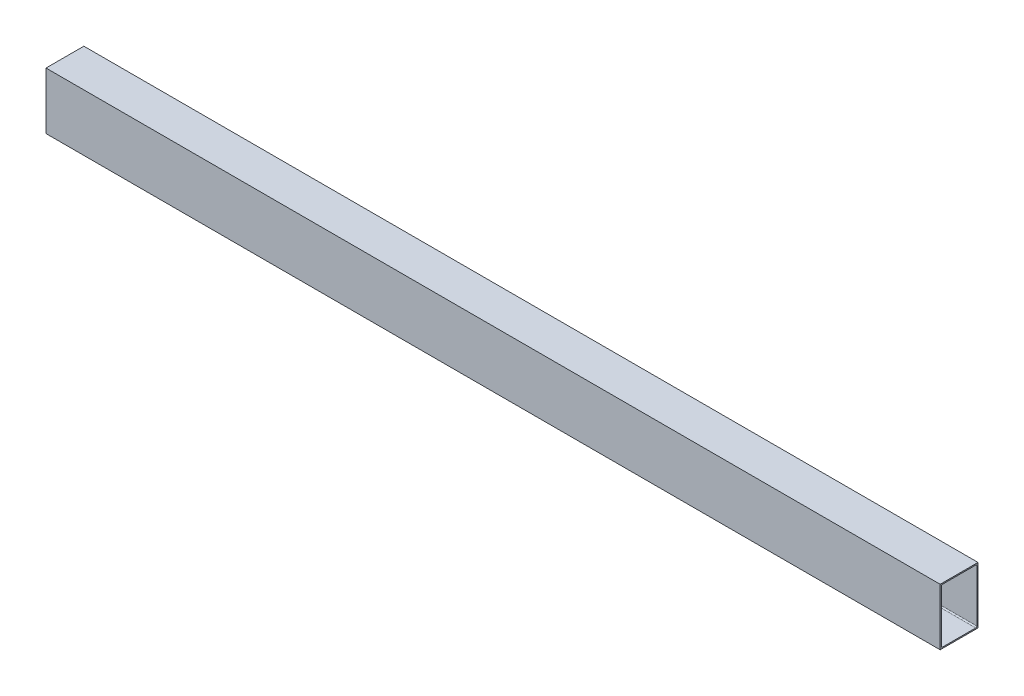
ISO-10303-21;
HEADER;
FILE_DESCRIPTION(('STEP AP214'),'2;1');
FILE_NAME('part.step','',(''),(''),'','','');
FILE_SCHEMA(('AUTOMOTIVE_DESIGN { 1 0 10303 214 1 1 1 1 }'));
ENDSEC;
DATA;
#1=APPLICATION_CONTEXT('core data for automotive mechanical design processes');
#2=APPLICATION_PROTOCOL_DEFINITION('international standard','automotive_design',2000,#1);
#3=PRODUCT_CONTEXT('',#1,'mechanical');
#4=PRODUCT('Part','Part','',(#3));
#5=PRODUCT_RELATED_PRODUCT_CATEGORY('part','',(#4));
#6=PRODUCT_DEFINITION_FORMATION('','',#4);
#7=PRODUCT_DEFINITION_CONTEXT('part definition',#1,'design');
#8=PRODUCT_DEFINITION('design','',#6,#7);
#9=PRODUCT_DEFINITION_SHAPE('','',#8);
#10=(LENGTH_UNIT() NAMED_UNIT(*) SI_UNIT(.MILLI.,.METRE.));
#11=(NAMED_UNIT(*) PLANE_ANGLE_UNIT() SI_UNIT($,.RADIAN.));
#12=(NAMED_UNIT(*) SI_UNIT($,.STERADIAN.) SOLID_ANGLE_UNIT());
#13=UNCERTAINTY_MEASURE_WITH_UNIT(LENGTH_MEASURE(1.E-05),#10,'distance_accuracy_value','');
#14=(GEOMETRIC_REPRESENTATION_CONTEXT(3) GLOBAL_UNCERTAINTY_ASSIGNED_CONTEXT((#13)) GLOBAL_UNIT_ASSIGNED_CONTEXT((#10,
#11,#12)) REPRESENTATION_CONTEXT('',''));
#15=CARTESIAN_POINT('',(0.,0.,0.));
#16=DIRECTION('',(0.,0.,1.));
#17=DIRECTION('',(1.,0.,0.));
#18=AXIS2_PLACEMENT_3D('',#15,#16,#17);
#19=CARTESIAN_POINT('',(2400.,0.,0.));
#20=DIRECTION('',(1.,0.,0.));
#21=DIRECTION('',(0.,0.,-1.));
#22=AXIS2_PLACEMENT_3D('',#19,#20,#21);
#23=PLANE('',#22);
#24=DIRECTION('',(0.,1.,0.));
#25=VECTOR('',#24,1.);
#26=CARTESIAN_POINT('',(2400.,0.,0.));
#27=LINE('',#26,#25);
#28=CARTESIAN_POINT('',(2400.,0.,0.));
#29=VERTEX_POINT('',#28);
#30=CARTESIAN_POINT('',(2400.,152.4,0.));
#31=VERTEX_POINT('',#30);
#32=EDGE_CURVE('E187',#29,#31,#27,.T.);
#33=ORIENTED_EDGE('',*,*,#32,.T.);
#34=DIRECTION('',(0.,0.,1.));
#35=VECTOR('',#34,1.);
#36=CARTESIAN_POINT('',(2400.,152.4,0.));
#37=LINE('',#36,#35);
#38=CARTESIAN_POINT('',(2400.,152.4,101.6));
#39=VERTEX_POINT('',#38);
#40=EDGE_CURVE('E190',#31,#39,#37,.T.);
#41=ORIENTED_EDGE('',*,*,#40,.T.);
#42=DIRECTION('',(0.,-1.,0.));
#43=VECTOR('',#42,1.);
#44=CARTESIAN_POINT('',(2400.,0.,101.6));
#45=LINE('',#44,#43);
#46=CARTESIAN_POINT('',(2400.,0.,101.6));
#47=VERTEX_POINT('',#46);
#48=EDGE_CURVE('E193',#39,#47,#45,.T.);
#49=ORIENTED_EDGE('',*,*,#48,.T.);
#50=DIRECTION('',(0.,0.,-1.));
#51=VECTOR('',#50,1.);
#52=CARTESIAN_POINT('',(2400.,0.,0.));
#53=LINE('',#52,#51);
#54=EDGE_CURVE('E195',#47,#29,#53,.T.);
#55=ORIENTED_EDGE('',*,*,#54,.T.);
#56=EDGE_LOOP('',(#33,#41,#49,#55));
#57=FACE_BOUND('',#56,.T.);
#58=DIRECTION('',(0.,0.,-1.));
#59=VECTOR('',#58,1.);
#60=CARTESIAN_POINT('',(2400.,3.175,6.35));
#61=LINE('',#60,#59);
#62=CARTESIAN_POINT('',(2400.,3.17499999999999,95.25));
#63=VERTEX_POINT('',#62);
#64=CARTESIAN_POINT('',(2400.,3.175,6.35));
#65=VERTEX_POINT('',#64);
#66=EDGE_CURVE('E130',#63,#65,#61,.T.);
#67=ORIENTED_EDGE('',*,*,#66,.F.);
#68=CARTESIAN_POINT('',(2400.,6.34999999999999,95.25));
#69=DIRECTION('',(1.,0.,0.));
#70=DIRECTION('',(0.,0.,-1.));
#71=AXIS2_PLACEMENT_3D('',#68,#69,#70);
#72=CIRCLE('',#71,3.17500000000001);
#73=CARTESIAN_POINT('',(2400.,6.34999999999999,98.425));
#74=VERTEX_POINT('',#73);
#75=EDGE_CURVE('E122',#74,#63,#72,.T.);
#76=ORIENTED_EDGE('',*,*,#75,.F.);
#77=DIRECTION('',(0.,-1.,0.));
#78=VECTOR('',#77,1.);
#79=CARTESIAN_POINT('',(2400.,6.34999999999999,98.425));
#80=LINE('',#79,#78);
#81=CARTESIAN_POINT('',(2400.,146.05,98.425));
#82=VERTEX_POINT('',#81);
#83=EDGE_CURVE('E155',#82,#74,#80,.T.);
#84=ORIENTED_EDGE('',*,*,#83,.F.);
#85=CARTESIAN_POINT('',(2400.,146.05,95.25));
#86=DIRECTION('',(1.,0.,0.));
#87=DIRECTION('',(0.,0.,1.));
#88=AXIS2_PLACEMENT_3D('',#85,#86,#87);
#89=CIRCLE('',#88,3.175);
#90=CARTESIAN_POINT('',(2400.,149.225,95.25));
#91=VERTEX_POINT('',#90);
#92=EDGE_CURVE('E153',#91,#82,#89,.T.);
#93=ORIENTED_EDGE('',*,*,#92,.F.);
#94=DIRECTION('',(0.,0.,1.));
#95=VECTOR('',#94,1.);
#96=CARTESIAN_POINT('',(2400.,149.225,6.35));
#97=LINE('',#96,#95);
#98=CARTESIAN_POINT('',(2400.,149.225,6.35));
#99=VERTEX_POINT('',#98);
#100=EDGE_CURVE('E151',#99,#91,#97,.T.);
#101=ORIENTED_EDGE('',*,*,#100,.F.);
#102=CARTESIAN_POINT('',(2400.,146.05,6.35));
#103=DIRECTION('',(1.,0.,0.));
#104=DIRECTION('',(0.,0.,1.));
#105=AXIS2_PLACEMENT_3D('',#102,#103,#104);
#106=CIRCLE('',#105,3.17500000000001);
#107=CARTESIAN_POINT('',(2400.,146.05,3.17499999999999));
#108=VERTEX_POINT('',#107);
#109=EDGE_CURVE('E149',#108,#99,#106,.T.);
#110=ORIENTED_EDGE('',*,*,#109,.F.);
#111=DIRECTION('',(0.,1.,0.));
#112=VECTOR('',#111,1.);
#113=CARTESIAN_POINT('',(2400.,6.35,3.175));
#114=LINE('',#113,#112);
#115=CARTESIAN_POINT('',(2400.,6.35,3.175));
#116=VERTEX_POINT('',#115);
#117=EDGE_CURVE('E145',#116,#108,#114,.T.);
#118=ORIENTED_EDGE('',*,*,#117,.F.);
#119=CARTESIAN_POINT('',(2400.,6.35,6.35));
#120=DIRECTION('',(1.,0.,0.));
#121=DIRECTION('',(0.,0.,1.));
#122=AXIS2_PLACEMENT_3D('',#119,#120,#121);
#123=CIRCLE('',#122,3.175);
#124=EDGE_CURVE('E143',#65,#116,#123,.T.);
#125=ORIENTED_EDGE('',*,*,#124,.F.);
#126=EDGE_LOOP('',(#67,#76,#84,#93,#101,#110,#118,#125));
#127=FACE_BOUND('',#126,.T.);
#128=ADVANCED_FACE('F33',(#57,#127),#23,.T.);
#129=CARTESIAN_POINT('',(0.,0.,0.));
#130=DIRECTION('',(1.,0.,0.));
#131=DIRECTION('',(0.,0.,-1.));
#132=AXIS2_PLACEMENT_3D('',#129,#130,#131);
#133=PLANE('',#132);
#134=DIRECTION('',(0.,1.,0.));
#135=VECTOR('',#134,1.);
#136=CARTESIAN_POINT('',(0.,0.,0.));
#137=LINE('',#136,#135);
#138=CARTESIAN_POINT('',(0.,0.,0.));
#139=VERTEX_POINT('',#138);
#140=CARTESIAN_POINT('',(0.,152.4,0.));
#141=VERTEX_POINT('',#140);
#142=EDGE_CURVE('E138',#139,#141,#137,.T.);
#143=ORIENTED_EDGE('',*,*,#142,.F.);
#144=DIRECTION('',(0.,0.,-1.));
#145=VECTOR('',#144,1.);
#146=CARTESIAN_POINT('',(0.,0.,0.));
#147=LINE('',#146,#145);
#148=CARTESIAN_POINT('',(0.,0.,101.6));
#149=VERTEX_POINT('',#148);
#150=EDGE_CURVE('E191',#149,#139,#147,.T.);
#151=ORIENTED_EDGE('',*,*,#150,.F.);
#152=DIRECTION('',(0.,-1.,0.));
#153=VECTOR('',#152,1.);
#154=CARTESIAN_POINT('',(0.,0.,101.6));
#155=LINE('',#154,#153);
#156=CARTESIAN_POINT('',(0.,152.4,101.6));
#157=VERTEX_POINT('',#156);
#158=EDGE_CURVE('E202',#157,#149,#155,.T.);
#159=ORIENTED_EDGE('',*,*,#158,.F.);
#160=DIRECTION('',(0.,0.,1.));
#161=VECTOR('',#160,1.);
#162=CARTESIAN_POINT('',(0.,152.4,0.));
#163=LINE('',#162,#161);
#164=EDGE_CURVE('E200',#141,#157,#163,.T.);
#165=ORIENTED_EDGE('',*,*,#164,.F.);
#166=EDGE_LOOP('',(#143,#151,#159,#165));
#167=FACE_BOUND('',#166,.T.);
#168=CARTESIAN_POINT('',(0.,6.34999999999999,95.25));
#169=DIRECTION('',(1.,0.,0.));
#170=DIRECTION('',(0.,0.,-1.));
#171=AXIS2_PLACEMENT_3D('',#168,#169,#170);
#172=CIRCLE('',#171,3.17500000000001);
#173=CARTESIAN_POINT('',(0.,6.34999999999999,98.425));
#174=VERTEX_POINT('',#173);
#175=CARTESIAN_POINT('',(0.,3.17499999999999,95.25));
#176=VERTEX_POINT('',#175);
#177=EDGE_CURVE('E56',#174,#176,#172,.T.);
#178=ORIENTED_EDGE('',*,*,#177,.T.);
#179=DIRECTION('',(0.,0.,-1.));
#180=VECTOR('',#179,1.);
#181=CARTESIAN_POINT('',(0.,3.175,6.35));
#182=LINE('',#181,#180);
#183=CARTESIAN_POINT('',(0.,3.175,6.35));
#184=VERTEX_POINT('',#183);
#185=EDGE_CURVE('E137',#176,#184,#182,.T.);
#186=ORIENTED_EDGE('',*,*,#185,.T.);
#187=CARTESIAN_POINT('',(0.,6.35,6.35));
#188=DIRECTION('',(1.,0.,0.));
#189=DIRECTION('',(0.,0.,1.));
#190=AXIS2_PLACEMENT_3D('',#187,#188,#189);
#191=CIRCLE('',#190,3.175);
#192=CARTESIAN_POINT('',(0.,6.35,3.175));
#193=VERTEX_POINT('',#192);
#194=EDGE_CURVE('E159',#184,#193,#191,.T.);
#195=ORIENTED_EDGE('',*,*,#194,.T.);
#196=DIRECTION('',(0.,1.,0.));
#197=VECTOR('',#196,1.);
#198=CARTESIAN_POINT('',(0.,6.35,3.175));
#199=LINE('',#198,#197);
#200=CARTESIAN_POINT('',(0.,146.05,3.17499999999999));
#201=VERTEX_POINT('',#200);
#202=EDGE_CURVE('E162',#193,#201,#199,.T.);
#203=ORIENTED_EDGE('',*,*,#202,.T.);
#204=CARTESIAN_POINT('',(0.,146.05,6.35));
#205=DIRECTION('',(1.,0.,0.));
#206=DIRECTION('',(0.,0.,1.));
#207=AXIS2_PLACEMENT_3D('',#204,#205,#206);
#208=CIRCLE('',#207,3.17500000000001);
#209=CARTESIAN_POINT('',(0.,149.225,6.35));
#210=VERTEX_POINT('',#209);
#211=EDGE_CURVE('E165',#201,#210,#208,.T.);
#212=ORIENTED_EDGE('',*,*,#211,.T.);
#213=DIRECTION('',(0.,0.,1.));
#214=VECTOR('',#213,1.);
#215=CARTESIAN_POINT('',(0.,149.225,6.35));
#216=LINE('',#215,#214);
#217=CARTESIAN_POINT('',(0.,149.225,95.25));
#218=VERTEX_POINT('',#217);
#219=EDGE_CURVE('E168',#210,#218,#216,.T.);
#220=ORIENTED_EDGE('',*,*,#219,.T.);
#221=CARTESIAN_POINT('',(0.,146.05,95.25));
#222=DIRECTION('',(1.,0.,0.));
#223=DIRECTION('',(0.,0.,1.));
#224=AXIS2_PLACEMENT_3D('',#221,#222,#223);
#225=CIRCLE('',#224,3.175);
#226=CARTESIAN_POINT('',(0.,146.05,98.425));
#227=VERTEX_POINT('',#226);
#228=EDGE_CURVE('E171',#218,#227,#225,.T.);
#229=ORIENTED_EDGE('',*,*,#228,.T.);
#230=DIRECTION('',(0.,-1.,0.));
#231=VECTOR('',#230,1.);
#232=CARTESIAN_POINT('',(0.,6.34999999999999,98.425));
#233=LINE('',#232,#231);
#234=EDGE_CURVE('E131',#227,#174,#233,.T.);
#235=ORIENTED_EDGE('',*,*,#234,.T.);
#236=EDGE_LOOP('',(#178,#186,#195,#203,#212,#220,#229,#235));
#237=FACE_BOUND('',#236,.T.);
#238=ADVANCED_FACE('F220',(#167,#237),#133,.F.);
#239=CARTESIAN_POINT('',(2400.,0.,0.));
#240=DIRECTION('',(0.,0.,1.));
#241=DIRECTION('',(1.,0.,0.));
#242=AXIS2_PLACEMENT_3D('',#239,#240,#241);
#243=PLANE('',#242);
#244=ORIENTED_EDGE('',*,*,#142,.T.);
#245=DIRECTION('',(-1.,0.,0.));
#246=VECTOR('',#245,1.);
#247=CARTESIAN_POINT('',(2400.,152.4,0.));
#248=LINE('',#247,#246);
#249=EDGE_CURVE('E11',#31,#141,#248,.T.);
#250=ORIENTED_EDGE('',*,*,#249,.F.);
#251=ORIENTED_EDGE('',*,*,#32,.F.);
#252=DIRECTION('',(-1.,0.,0.));
#253=VECTOR('',#252,1.);
#254=CARTESIAN_POINT('',(2400.,0.,0.));
#255=LINE('',#254,#253);
#256=EDGE_CURVE('E197',#29,#139,#255,.T.);
#257=ORIENTED_EDGE('',*,*,#256,.T.);
#258=EDGE_LOOP('',(#244,#250,#251,#257));
#259=FACE_BOUND('',#258,.T.);
#260=ADVANCED_FACE('F35',(#259),#243,.F.);
#261=CARTESIAN_POINT('',(2400.,152.4,0.));
#262=DIRECTION('',(0.,-1.,0.));
#263=DIRECTION('',(0.,0.,-1.));
#264=AXIS2_PLACEMENT_3D('',#261,#262,#263);
#265=PLANE('',#264);
#266=ORIENTED_EDGE('',*,*,#164,.T.);
#267=DIRECTION('',(-1.,0.,0.));
#268=VECTOR('',#267,1.);
#269=CARTESIAN_POINT('',(2400.,152.4,101.6));
#270=LINE('',#269,#268);
#271=EDGE_CURVE('E41',#39,#157,#270,.T.);
#272=ORIENTED_EDGE('',*,*,#271,.F.);
#273=ORIENTED_EDGE('',*,*,#40,.F.);
#274=ORIENTED_EDGE('',*,*,#249,.T.);
#275=EDGE_LOOP('',(#266,#272,#273,#274));
#276=FACE_BOUND('',#275,.T.);
#277=ADVANCED_FACE('F230',(#276),#265,.F.);
#278=CARTESIAN_POINT('',(2400.,0.,101.6));
#279=DIRECTION('',(0.,0.,-1.));
#280=DIRECTION('',(-1.,0.,0.));
#281=AXIS2_PLACEMENT_3D('',#278,#279,#280);
#282=PLANE('',#281);
#283=ORIENTED_EDGE('',*,*,#158,.T.);
#284=DIRECTION('',(-1.,0.,0.));
#285=VECTOR('',#284,1.);
#286=CARTESIAN_POINT('',(2400.,0.,101.6));
#287=LINE('',#286,#285);
#288=EDGE_CURVE('E207',#47,#149,#287,.T.);
#289=ORIENTED_EDGE('',*,*,#288,.F.);
#290=ORIENTED_EDGE('',*,*,#48,.F.);
#291=ORIENTED_EDGE('',*,*,#271,.T.);
#292=EDGE_LOOP('',(#283,#289,#290,#291));
#293=FACE_BOUND('',#292,.T.);
#294=ADVANCED_FACE('F214',(#293),#282,.F.);
#295=CARTESIAN_POINT('',(2400.,0.,0.));
#296=DIRECTION('',(0.,1.,0.));
#297=DIRECTION('',(0.,0.,1.));
#298=AXIS2_PLACEMENT_3D('',#295,#296,#297);
#299=PLANE('',#298);
#300=ORIENTED_EDGE('',*,*,#150,.T.);
#301=ORIENTED_EDGE('',*,*,#256,.F.);
#302=ORIENTED_EDGE('',*,*,#54,.F.);
#303=ORIENTED_EDGE('',*,*,#288,.T.);
#304=EDGE_LOOP('',(#300,#301,#302,#303));
#305=FACE_BOUND('',#304,.T.);
#306=ADVANCED_FACE('F224',(#305),#299,.F.);
#307=CARTESIAN_POINT('',(2400.,6.34999999999999,95.25));
#308=DIRECTION('',(-1.,0.,0.));
#309=DIRECTION('',(0.,0.,1.));
#310=AXIS2_PLACEMENT_3D('',#307,#308,#309);
#311=CYLINDRICAL_SURFACE('',#310,3.17500000000001);
#312=ORIENTED_EDGE('',*,*,#177,.F.);
#313=DIRECTION('',(-1.,0.,0.));
#314=VECTOR('',#313,1.);
#315=CARTESIAN_POINT('',(2400.,6.34999999999999,98.425));
#316=LINE('',#315,#314);
#317=EDGE_CURVE('E126',#74,#174,#316,.T.);
#318=ORIENTED_EDGE('',*,*,#317,.F.);
#319=ORIENTED_EDGE('',*,*,#75,.T.);
#320=DIRECTION('',(-1.,0.,0.));
#321=VECTOR('',#320,1.);
#322=CARTESIAN_POINT('',(2400.,3.17499999999999,95.25));
#323=LINE('',#322,#321);
#324=EDGE_CURVE('E125',#63,#176,#323,.T.);
#325=ORIENTED_EDGE('',*,*,#324,.T.);
#326=EDGE_LOOP('',(#312,#318,#319,#325));
#327=FACE_BOUND('',#326,.T.);
#328=ADVANCED_FACE('F124',(#327),#311,.F.);
#329=CARTESIAN_POINT('',(2400.,3.175,6.35));
#330=DIRECTION('',(0.,1.,0.));
#331=DIRECTION('',(0.,0.,1.));
#332=AXIS2_PLACEMENT_3D('',#329,#330,#331);
#333=PLANE('',#332);
#334=ORIENTED_EDGE('',*,*,#185,.F.);
#335=ORIENTED_EDGE('',*,*,#324,.F.);
#336=ORIENTED_EDGE('',*,*,#66,.T.);
#337=DIRECTION('',(-1.,0.,0.));
#338=VECTOR('',#337,1.);
#339=CARTESIAN_POINT('',(2400.,3.175,6.35));
#340=LINE('',#339,#338);
#341=EDGE_CURVE('E139',#65,#184,#340,.T.);
#342=ORIENTED_EDGE('',*,*,#341,.T.);
#343=EDGE_LOOP('',(#334,#335,#336,#342));
#344=FACE_BOUND('',#343,.T.);
#345=ADVANCED_FACE('F134',(#344),#333,.T.);
#346=CARTESIAN_POINT('',(2400.,6.35,6.35));
#347=DIRECTION('',(-1.,0.,0.));
#348=DIRECTION('',(0.,0.,1.));
#349=AXIS2_PLACEMENT_3D('',#346,#347,#348);
#350=CYLINDRICAL_SURFACE('',#349,3.175);
#351=ORIENTED_EDGE('',*,*,#194,.F.);
#352=ORIENTED_EDGE('',*,*,#341,.F.);
#353=ORIENTED_EDGE('',*,*,#124,.T.);
#354=DIRECTION('',(-1.,0.,0.));
#355=VECTOR('',#354,1.);
#356=CARTESIAN_POINT('',(2400.,6.35,3.175));
#357=LINE('',#356,#355);
#358=EDGE_CURVE('E184',#116,#193,#357,.T.);
#359=ORIENTED_EDGE('',*,*,#358,.T.);
#360=EDGE_LOOP('',(#351,#352,#353,#359));
#361=FACE_BOUND('',#360,.T.);
#362=ADVANCED_FACE('F253',(#361),#350,.F.);
#363=CARTESIAN_POINT('',(2400.,6.35,3.175));
#364=DIRECTION('',(0.,0.,1.));
#365=DIRECTION('',(0.,-1.,0.));
#366=AXIS2_PLACEMENT_3D('',#363,#364,#365);
#367=PLANE('',#366);
#368=ORIENTED_EDGE('',*,*,#202,.F.);
#369=ORIENTED_EDGE('',*,*,#358,.F.);
#370=ORIENTED_EDGE('',*,*,#117,.T.);
#371=DIRECTION('',(-1.,0.,0.));
#372=VECTOR('',#371,1.);
#373=CARTESIAN_POINT('',(2400.,146.05,3.17499999999999));
#374=LINE('',#373,#372);
#375=EDGE_CURVE('E182',#108,#201,#374,.T.);
#376=ORIENTED_EDGE('',*,*,#375,.T.);
#377=EDGE_LOOP('',(#368,#369,#370,#376));
#378=FACE_BOUND('',#377,.T.);
#379=ADVANCED_FACE('F257',(#378),#367,.T.);
#380=CARTESIAN_POINT('',(2400.,146.05,6.35));
#381=DIRECTION('',(-1.,0.,0.));
#382=DIRECTION('',(0.,0.,1.));
#383=AXIS2_PLACEMENT_3D('',#380,#381,#382);
#384=CYLINDRICAL_SURFACE('',#383,3.17500000000001);
#385=ORIENTED_EDGE('',*,*,#211,.F.);
#386=ORIENTED_EDGE('',*,*,#375,.F.);
#387=ORIENTED_EDGE('',*,*,#109,.T.);
#388=DIRECTION('',(-1.,0.,0.));
#389=VECTOR('',#388,1.);
#390=CARTESIAN_POINT('',(2400.,149.225,6.35));
#391=LINE('',#390,#389);
#392=EDGE_CURVE('E180',#99,#210,#391,.T.);
#393=ORIENTED_EDGE('',*,*,#392,.T.);
#394=EDGE_LOOP('',(#385,#386,#387,#393));
#395=FACE_BOUND('',#394,.T.);
#396=ADVANCED_FACE('F263',(#395),#384,.F.);
#397=CARTESIAN_POINT('',(2400.,149.225,6.35));
#398=DIRECTION('',(0.,-1.,0.));
#399=DIRECTION('',(0.,0.,-1.));
#400=AXIS2_PLACEMENT_3D('',#397,#398,#399);
#401=PLANE('',#400);
#402=ORIENTED_EDGE('',*,*,#219,.F.);
#403=ORIENTED_EDGE('',*,*,#392,.F.);
#404=ORIENTED_EDGE('',*,*,#100,.T.);
#405=DIRECTION('',(-1.,0.,0.));
#406=VECTOR('',#405,1.);
#407=CARTESIAN_POINT('',(2400.,149.225,95.25));
#408=LINE('',#407,#406);
#409=EDGE_CURVE('E178',#91,#218,#408,.T.);
#410=ORIENTED_EDGE('',*,*,#409,.T.);
#411=EDGE_LOOP('',(#402,#403,#404,#410));
#412=FACE_BOUND('',#411,.T.);
#413=ADVANCED_FACE('F267',(#412),#401,.T.);
#414=CARTESIAN_POINT('',(2400.,146.05,95.25));
#415=DIRECTION('',(-1.,0.,0.));
#416=DIRECTION('',(0.,0.,1.));
#417=AXIS2_PLACEMENT_3D('',#414,#415,#416);
#418=CYLINDRICAL_SURFACE('',#417,3.175);
#419=ORIENTED_EDGE('',*,*,#228,.F.);
#420=ORIENTED_EDGE('',*,*,#409,.F.);
#421=ORIENTED_EDGE('',*,*,#92,.T.);
#422=DIRECTION('',(-1.,0.,0.));
#423=VECTOR('',#422,1.);
#424=CARTESIAN_POINT('',(2400.,146.05,98.425));
#425=LINE('',#424,#423);
#426=EDGE_CURVE('E48',#82,#227,#425,.T.);
#427=ORIENTED_EDGE('',*,*,#426,.T.);
#428=EDGE_LOOP('',(#419,#420,#421,#427));
#429=FACE_BOUND('',#428,.T.);
#430=ADVANCED_FACE('F271',(#429),#418,.F.);
#431=CARTESIAN_POINT('',(2400.,6.34999999999999,98.425));
#432=DIRECTION('',(0.,0.,-1.));
#433=DIRECTION('',(0.,1.,0.));
#434=AXIS2_PLACEMENT_3D('',#431,#432,#433);
#435=PLANE('',#434);
#436=ORIENTED_EDGE('',*,*,#234,.F.);
#437=ORIENTED_EDGE('',*,*,#426,.F.);
#438=ORIENTED_EDGE('',*,*,#83,.T.);
#439=ORIENTED_EDGE('',*,*,#317,.T.);
#440=EDGE_LOOP('',(#436,#437,#438,#439));
#441=FACE_BOUND('',#440,.T.);
#442=ADVANCED_FACE('F275',(#441),#435,.T.);
#443=CLOSED_SHELL('',(#128,#238,#260,#277,#294,#306,#328,#345,#362,#379,#396,#413,#430,#442));
#444=MANIFOLD_SOLID_BREP('B2',#443);
#445=ADVANCED_BREP_SHAPE_REPRESENTATION('',(#18,#444),#14);
#446=SHAPE_DEFINITION_REPRESENTATION(#9,#445);
ENDSEC;
END-ISO-10303-21;
